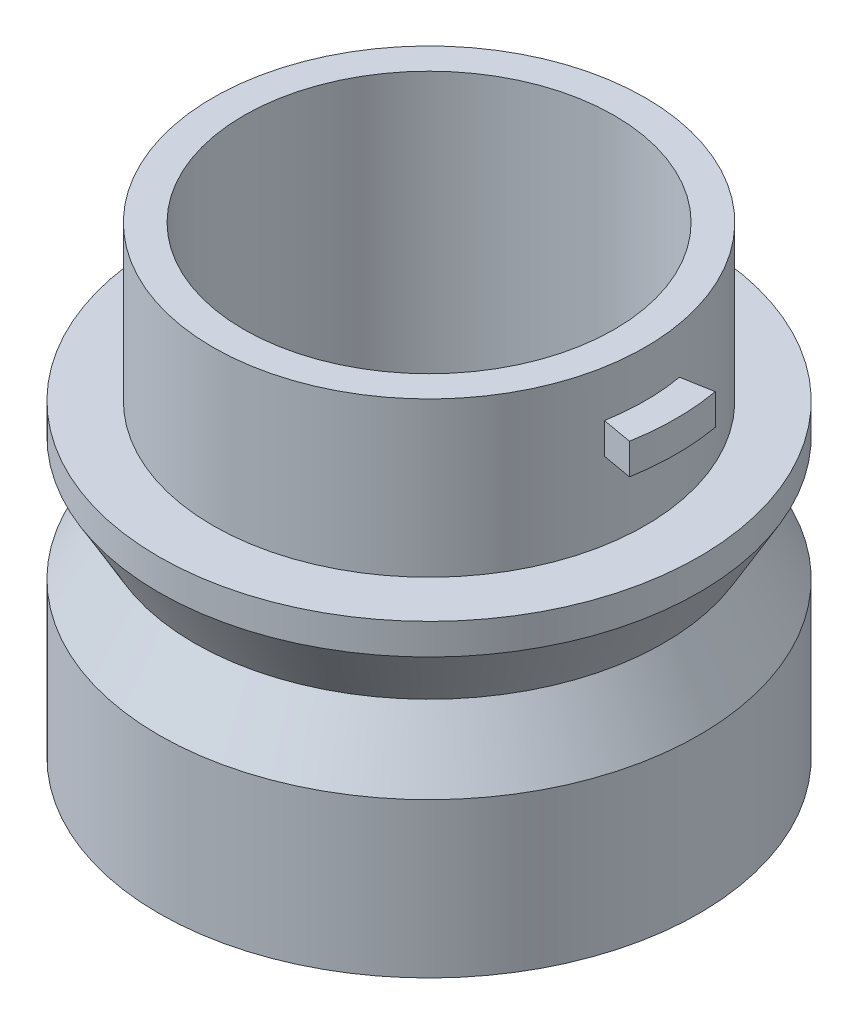
ISO-10303-21;
HEADER;
FILE_DESCRIPTION(('STEP AP214'),'2;1');
FILE_NAME('part.step','',(''),(''),'','','');
FILE_SCHEMA(('AUTOMOTIVE_DESIGN { 1 0 10303 214 1 1 1 1 }'));
ENDSEC;
DATA;
#1=APPLICATION_CONTEXT('core data for automotive mechanical design processes');
#2=APPLICATION_PROTOCOL_DEFINITION('international standard','automotive_design',2000,#1);
#3=PRODUCT_CONTEXT('',#1,'mechanical');
#4=PRODUCT('Part','Part','',(#3));
#5=PRODUCT_RELATED_PRODUCT_CATEGORY('part','',(#4));
#6=PRODUCT_DEFINITION_FORMATION('','',#4);
#7=PRODUCT_DEFINITION_CONTEXT('part definition',#1,'design');
#8=PRODUCT_DEFINITION('design','',#6,#7);
#9=PRODUCT_DEFINITION_SHAPE('','',#8);
#10=(LENGTH_UNIT() NAMED_UNIT(*) SI_UNIT(.MILLI.,.METRE.));
#11=(NAMED_UNIT(*) PLANE_ANGLE_UNIT() SI_UNIT($,.RADIAN.));
#12=(NAMED_UNIT(*) SI_UNIT($,.STERADIAN.) SOLID_ANGLE_UNIT());
#13=UNCERTAINTY_MEASURE_WITH_UNIT(LENGTH_MEASURE(1.E-05),#10,'distance_accuracy_value','');
#14=(GEOMETRIC_REPRESENTATION_CONTEXT(3) GLOBAL_UNCERTAINTY_ASSIGNED_CONTEXT((#13)) GLOBAL_UNIT_ASSIGNED_CONTEXT((#10,
#11,#12)) REPRESENTATION_CONTEXT('',''));
#15=CARTESIAN_POINT('',(0.,0.,0.));
#16=DIRECTION('',(0.,0.,1.));
#17=DIRECTION('',(1.,0.,0.));
#18=AXIS2_PLACEMENT_3D('',#15,#16,#17);
#19=CARTESIAN_POINT('',(0.,40.467735012162,0.));
#20=DIRECTION('',(0.,1.,0.));
#21=DIRECTION('',(0.,0.,1.));
#22=AXIS2_PLACEMENT_3D('',#19,#20,#21);
#23=CYLINDRICAL_SURFACE('',#22,14.5);
#24=DIRECTION('',(0.,-1.,0.));
#25=VECTOR('',#24,1.);
#26=CARTESIAN_POINT('',(14.156292103239,-15.,-3.1383744021025));
#27=LINE('',#26,#25);
#28=CARTESIAN_POINT('',(14.156292103239,-10.7,-3.1383744021025));
#29=VERTEX_POINT('',#28);
#30=CARTESIAN_POINT('',(14.156292103239,-15.,-3.1383744021025));
#31=VERTEX_POINT('',#30);
#32=EDGE_CURVE('E58',#29,#31,#27,.T.);
#33=ORIENTED_EDGE('',*,*,#32,.F.);
#34=CARTESIAN_POINT('',(0.,-10.7,0.));
#35=DIRECTION('',(0.,-1.,0.));
#36=DIRECTION('',(0.,0.,-1.));
#37=AXIS2_PLACEMENT_3D('',#34,#35,#36);
#38=CIRCLE('',#37,14.5);
#39=CARTESIAN_POINT('',(10.2530483272049,-10.7,-10.253048327205));
#40=VERTEX_POINT('',#39);
#41=EDGE_CURVE('E190',#29,#40,#38,.F.);
#42=ORIENTED_EDGE('',*,*,#41,.T.);
#43=DIRECTION('',(0.,1.,0.));
#44=VECTOR('',#43,1.);
#45=CARTESIAN_POINT('',(10.2530483272049,40.467735012162,-10.253048327205));
#46=LINE('',#45,#44);
#47=CARTESIAN_POINT('',(10.2530483272049,-8.2,-10.253048327205));
#48=VERTEX_POINT('',#47);
#49=EDGE_CURVE('E11',#48,#40,#46,.F.);
#50=ORIENTED_EDGE('',*,*,#49,.F.);
#51=CARTESIAN_POINT('',(0.,-8.2,0.));
#52=DIRECTION('',(0.,1.,0.));
#53=DIRECTION('',(0.,0.,1.));
#54=AXIS2_PLACEMENT_3D('',#51,#52,#53);
#55=CIRCLE('',#54,14.5);
#56=CARTESIAN_POINT('',(14.156292103239,-8.2,3.1383744021025));
#57=VERTEX_POINT('',#56);
#58=EDGE_CURVE('E230',#57,#48,#55,.T.);
#59=ORIENTED_EDGE('',*,*,#58,.F.);
#60=DIRECTION('',(0.,-1.,0.));
#61=VECTOR('',#60,1.);
#62=CARTESIAN_POINT('',(14.156292103239,-15.,3.1383744021025));
#63=LINE('',#62,#61);
#64=CARTESIAN_POINT('',(14.156292103239,-15.,3.1383744021025));
#65=VERTEX_POINT('',#64);
#66=EDGE_CURVE('E221',#57,#65,#63,.T.);
#67=ORIENTED_EDGE('',*,*,#66,.T.);
#68=CARTESIAN_POINT('',(0.,-15.,0.));
#69=DIRECTION('',(0.,1.,0.));
#70=DIRECTION('',(0.,0.,1.));
#71=AXIS2_PLACEMENT_3D('',#68,#69,#70);
#72=CIRCLE('',#71,14.5);
#73=CARTESIAN_POINT('',(-14.156292103239,-15.,3.1383744021025));
#74=VERTEX_POINT('',#73);
#75=EDGE_CURVE('E346',#74,#65,#72,.T.);
#76=ORIENTED_EDGE('',*,*,#75,.F.);
#77=DIRECTION('',(0.,1.,0.));
#78=VECTOR('',#77,1.);
#79=CARTESIAN_POINT('',(-14.156292103239,-8.2,3.1383744021025));
#80=LINE('',#79,#78);
#81=CARTESIAN_POINT('',(-14.156292103239,-10.7,3.1383744021025));
#82=VERTEX_POINT('',#81);
#83=EDGE_CURVE('E238',#74,#82,#80,.T.);
#84=ORIENTED_EDGE('',*,*,#83,.T.);
#85=CARTESIAN_POINT('',(0.,-10.7,0.));
#86=DIRECTION('',(0.,1.,0.));
#87=DIRECTION('',(0.,0.,1.));
#88=AXIS2_PLACEMENT_3D('',#85,#86,#87);
#89=CIRCLE('',#88,14.5);
#90=CARTESIAN_POINT('',(-10.2530483272049,-10.7,10.253048327205));
#91=VERTEX_POINT('',#90);
#92=EDGE_CURVE('E50',#91,#82,#89,.F.);
#93=ORIENTED_EDGE('',*,*,#92,.F.);
#94=DIRECTION('',(0.,1.,0.));
#95=VECTOR('',#94,1.);
#96=CARTESIAN_POINT('',(-10.2530483272049,40.467735012162,10.253048327205));
#97=LINE('',#96,#95);
#98=CARTESIAN_POINT('',(-10.2530483272049,-8.2,10.253048327205));
#99=VERTEX_POINT('',#98);
#100=EDGE_CURVE('E360',#91,#99,#97,.T.);
#101=ORIENTED_EDGE('',*,*,#100,.T.);
#102=CARTESIAN_POINT('',(0.,-8.2,0.));
#103=DIRECTION('',(0.,1.,0.));
#104=DIRECTION('',(0.,0.,1.));
#105=AXIS2_PLACEMENT_3D('',#102,#103,#104);
#106=CIRCLE('',#105,14.5);
#107=CARTESIAN_POINT('',(-14.156292103239,-8.2,-3.1383744021025));
#108=VERTEX_POINT('',#107);
#109=EDGE_CURVE('E254',#108,#99,#106,.T.);
#110=ORIENTED_EDGE('',*,*,#109,.F.);
#111=DIRECTION('',(0.,1.,0.));
#112=VECTOR('',#111,1.);
#113=CARTESIAN_POINT('',(-14.156292103239,-8.2,-3.1383744021025));
#114=LINE('',#113,#112);
#115=CARTESIAN_POINT('',(-14.156292103239,-15.,-3.1383744021025));
#116=VERTEX_POINT('',#115);
#117=EDGE_CURVE('E247',#116,#108,#114,.T.);
#118=ORIENTED_EDGE('',*,*,#117,.F.);
#119=EDGE_CURVE('E345',#31,#116,#72,.T.);
#120=ORIENTED_EDGE('',*,*,#119,.F.);
#121=EDGE_LOOP('',(#33,#42,#50,#59,#67,#76,#84,#93,#101,#110,#118,#120));
#122=FACE_BOUND('',#121,.T.);
#123=CARTESIAN_POINT('',(0.,-5.,0.));
#124=DIRECTION('',(0.,1.,0.));
#125=DIRECTION('',(0.,0.,1.));
#126=AXIS2_PLACEMENT_3D('',#123,#124,#125);
#127=CIRCLE('',#126,14.5);
#128=CARTESIAN_POINT('',(0.,-5.,14.5));
#129=VERTEX_POINT('',#128);
#130=EDGE_CURVE('E349',#129,#129,#127,.T.);
#131=ORIENTED_EDGE('',*,*,#130,.T.);
#132=EDGE_LOOP('',(#131));
#133=FACE_BOUND('',#132,.T.);
#134=ADVANCED_FACE('F35',(#122,#133),#23,.F.);
#135=CARTESIAN_POINT('',(-16.3041433189029,-15.,3.61454155276633));
#136=DIRECTION('',(0.216439613938103,0.,0.976296007119933));
#137=DIRECTION('',(0.976296007119933,0.,-0.216439613938103));
#138=AXIS2_PLACEMENT_3D('',#135,#136,#137);
#139=PLANE('',#138);
#140=DIRECTION('',(-0.976296007119933,0.,0.216439613938103));
#141=VECTOR('',#140,1.);
#142=CARTESIAN_POINT('',(-16.3041433189029,-10.7,3.61454155276633));
#143=LINE('',#142,#141);
#144=CARTESIAN_POINT('',(-16.3041433189029,-10.7,3.61454155276633));
#145=VERTEX_POINT('',#144);
#146=EDGE_CURVE('E358',#82,#145,#143,.T.);
#147=ORIENTED_EDGE('',*,*,#146,.F.);
#148=ORIENTED_EDGE('',*,*,#83,.F.);
#149=DIRECTION('',(0.976296007119933,0.,-0.216439613938103));
#150=VECTOR('',#149,1.);
#151=CARTESIAN_POINT('',(-16.3041433189029,-15.,3.61454155276633));
#152=LINE('',#151,#150);
#153=CARTESIAN_POINT('',(-16.3041433189029,-15.,3.61454155276633));
#154=VERTEX_POINT('',#153);
#155=EDGE_CURVE('E235',#154,#74,#152,.T.);
#156=ORIENTED_EDGE('',*,*,#155,.F.);
#157=DIRECTION('',(0.,-1.,0.));
#158=VECTOR('',#157,1.);
#159=CARTESIAN_POINT('',(-16.3041433189029,-8.2,3.61454155276633));
#160=LINE('',#159,#158);
#161=EDGE_CURVE('E233',#145,#154,#160,.T.);
#162=ORIENTED_EDGE('',*,*,#161,.F.);
#163=EDGE_LOOP('',(#147,#148,#156,#162));
#164=FACE_BOUND('',#163,.T.);
#165=ADVANCED_FACE('F406',(#164),#139,.F.);
#166=CARTESIAN_POINT('',(14.5,-15.,0.));
#167=DIRECTION('',(0.,1.,0.));
#168=DIRECTION('',(0.,0.,1.));
#169=AXIS2_PLACEMENT_3D('',#166,#167,#168);
#170=PLANE('',#169);
#171=CARTESIAN_POINT('',(0.,-15.,0.));
#172=DIRECTION('',(0.,1.,0.));
#173=DIRECTION('',(0.,0.,1.));
#174=AXIS2_PLACEMENT_3D('',#171,#172,#173);
#175=CIRCLE('',#174,17.5);
#176=CARTESIAN_POINT('',(0.,-15.,17.5));
#177=VERTEX_POINT('',#176);
#178=EDGE_CURVE('E342',#177,#177,#175,.T.);
#179=ORIENTED_EDGE('',*,*,#178,.F.);
#180=EDGE_LOOP('',(#179));
#181=FACE_BOUND('',#180,.T.);
#182=ORIENTED_EDGE('',*,*,#75,.T.);
#183=DIRECTION('',(0.976296007119933,0.,0.216439613938103));
#184=VECTOR('',#183,1.);
#185=CARTESIAN_POINT('',(16.3041433189029,-15.,3.61454155276633));
#186=LINE('',#185,#184);
#187=CARTESIAN_POINT('',(16.3041433189029,-15.,3.61454155276633));
#188=VERTEX_POINT('',#187);
#189=EDGE_CURVE('E224',#65,#188,#186,.T.);
#190=ORIENTED_EDGE('',*,*,#189,.T.);
#191=CARTESIAN_POINT('',(0.,-15.,0.));
#192=DIRECTION('',(0.,1.,0.));
#193=DIRECTION('',(0.,0.,1.));
#194=AXIS2_PLACEMENT_3D('',#191,#192,#193);
#195=CIRCLE('',#194,16.7);
#196=CARTESIAN_POINT('',(16.3041433189029,-15.,-3.61454155276633));
#197=VERTEX_POINT('',#196);
#198=EDGE_CURVE('E227',#188,#197,#195,.T.);
#199=ORIENTED_EDGE('',*,*,#198,.T.);
#200=DIRECTION('',(0.976296007119933,0.,-0.216439613938103));
#201=VECTOR('',#200,1.);
#202=CARTESIAN_POINT('',(16.3041433189029,-15.,-3.61454155276633));
#203=LINE('',#202,#201);
#204=EDGE_CURVE('E215',#31,#197,#203,.T.);
#205=ORIENTED_EDGE('',*,*,#204,.F.);
#206=ORIENTED_EDGE('',*,*,#119,.T.);
#207=DIRECTION('',(0.976296007119933,0.,0.216439613938103));
#208=VECTOR('',#207,1.);
#209=CARTESIAN_POINT('',(-16.3041433189029,-15.,-3.61454155276633));
#210=LINE('',#209,#208);
#211=CARTESIAN_POINT('',(-16.3041433189029,-15.,-3.61454155276633));
#212=VERTEX_POINT('',#211);
#213=EDGE_CURVE('E244',#212,#116,#210,.T.);
#214=ORIENTED_EDGE('',*,*,#213,.F.);
#215=CARTESIAN_POINT('',(0.,-15.,0.));
#216=DIRECTION('',(0.,1.,0.));
#217=DIRECTION('',(0.,0.,1.));
#218=AXIS2_PLACEMENT_3D('',#215,#216,#217);
#219=CIRCLE('',#218,16.7);
#220=EDGE_CURVE('E256',#212,#154,#219,.T.);
#221=ORIENTED_EDGE('',*,*,#220,.T.);
#222=ORIENTED_EDGE('',*,*,#155,.T.);
#223=EDGE_LOOP('',(#182,#190,#199,#205,#206,#214,#221,#222));
#224=FACE_BOUND('',#223,.T.);
#225=ADVANCED_FACE('F384',(#181,#224),#170,.F.);
#226=CARTESIAN_POINT('',(0.,40.467735012162,0.));
#227=DIRECTION('',(0.,1.,0.));
#228=DIRECTION('',(0.,0.,1.));
#229=AXIS2_PLACEMENT_3D('',#226,#227,#228);
#230=CYLINDRICAL_SURFACE('',#229,14.);
#231=CARTESIAN_POINT('',(0.,9.99999999999999,0.));
#232=DIRECTION('',(0.,1.,0.));
#233=DIRECTION('',(0.,0.,1.));
#234=AXIS2_PLACEMENT_3D('',#231,#232,#233);
#235=CIRCLE('',#234,14.);
#236=CARTESIAN_POINT('',(-13.7873085421709,10.,-2.43107448733703));
#237=VERTEX_POINT('',#236);
#238=CARTESIAN_POINT('',(-13.7873085421709,10.,2.43107448733703));
#239=VERTEX_POINT('',#238);
#240=EDGE_CURVE('E286',#237,#239,#235,.T.);
#241=ORIENTED_EDGE('',*,*,#240,.F.);
#242=DIRECTION('',(0.,1.,0.));
#243=VECTOR('',#242,1.);
#244=CARTESIAN_POINT('',(-13.7873085421709,12.,-2.43107448733703));
#245=LINE('',#244,#243);
#246=CARTESIAN_POINT('',(-13.7873085421709,12.,-2.43107448733703));
#247=VERTEX_POINT('',#246);
#248=EDGE_CURVE('E280',#237,#247,#245,.T.);
#249=ORIENTED_EDGE('',*,*,#248,.T.);
#250=CARTESIAN_POINT('',(0.,12.,0.));
#251=DIRECTION('',(0.,1.,0.));
#252=DIRECTION('',(0.,0.,1.));
#253=AXIS2_PLACEMENT_3D('',#250,#251,#252);
#254=CIRCLE('',#253,14.);
#255=CARTESIAN_POINT('',(-13.7873085421709,12.,2.43107448733703));
#256=VERTEX_POINT('',#255);
#257=EDGE_CURVE('E289',#247,#256,#254,.T.);
#258=ORIENTED_EDGE('',*,*,#257,.T.);
#259=DIRECTION('',(0.,1.,0.));
#260=VECTOR('',#259,1.);
#261=CARTESIAN_POINT('',(-13.7873085421709,12.,2.43107448733703));
#262=LINE('',#261,#260);
#263=EDGE_CURVE('E268',#239,#256,#262,.T.);
#264=ORIENTED_EDGE('',*,*,#263,.F.);
#265=EDGE_LOOP('',(#241,#249,#258,#264));
#266=FACE_BOUND('',#265,.T.);
#267=CARTESIAN_POINT('',(0.,5.,0.));
#268=DIRECTION('',(0.,1.,0.));
#269=DIRECTION('',(0.,0.,1.));
#270=AXIS2_PLACEMENT_3D('',#267,#268,#269);
#271=CIRCLE('',#270,14.);
#272=CARTESIAN_POINT('',(0.,5.,14.));
#273=VERTEX_POINT('',#272);
#274=EDGE_CURVE('E327',#273,#273,#271,.T.);
#275=ORIENTED_EDGE('',*,*,#274,.T.);
#276=EDGE_LOOP('',(#275));
#277=FACE_BOUND('',#276,.T.);
#278=CARTESIAN_POINT('',(0.,15.,0.));
#279=DIRECTION('',(0.,1.,0.));
#280=DIRECTION('',(0.,0.,1.));
#281=AXIS2_PLACEMENT_3D('',#278,#279,#280);
#282=CIRCLE('',#281,14.);
#283=CARTESIAN_POINT('',(0.,15.,14.));
#284=VERTEX_POINT('',#283);
#285=EDGE_CURVE('E324',#284,#284,#282,.T.);
#286=ORIENTED_EDGE('',*,*,#285,.F.);
#287=EDGE_LOOP('',(#286));
#288=FACE_BOUND('',#287,.T.);
#289=DIRECTION('',(0.,-1.,0.));
#290=VECTOR('',#289,1.);
#291=CARTESIAN_POINT('',(13.7873085421709,10.,2.43107448733703));
#292=LINE('',#291,#290);
#293=CARTESIAN_POINT('',(13.7873085421709,12.,2.43107448733703));
#294=VERTEX_POINT('',#293);
#295=CARTESIAN_POINT('',(13.7873085421709,10.,2.43107448733703));
#296=VERTEX_POINT('',#295);
#297=EDGE_CURVE('E302',#294,#296,#292,.T.);
#298=ORIENTED_EDGE('',*,*,#297,.F.);
#299=CARTESIAN_POINT('',(0.,12.,0.));
#300=DIRECTION('',(0.,1.,0.));
#301=DIRECTION('',(0.,0.,1.));
#302=AXIS2_PLACEMENT_3D('',#299,#300,#301);
#303=CIRCLE('',#302,14.);
#304=CARTESIAN_POINT('',(13.7873085421709,12.,-2.43107448733703));
#305=VERTEX_POINT('',#304);
#306=EDGE_CURVE('E321',#294,#305,#303,.T.);
#307=ORIENTED_EDGE('',*,*,#306,.T.);
#308=DIRECTION('',(0.,-1.,0.));
#309=VECTOR('',#308,1.);
#310=CARTESIAN_POINT('',(13.7873085421709,10.,-2.43107448733703));
#311=LINE('',#310,#309);
#312=CARTESIAN_POINT('',(13.7873085421709,10.,-2.43107448733703));
#313=VERTEX_POINT('',#312);
#314=EDGE_CURVE('E291',#305,#313,#311,.T.);
#315=ORIENTED_EDGE('',*,*,#314,.T.);
#316=CARTESIAN_POINT('',(0.,9.99999999999999,0.));
#317=DIRECTION('',(0.,1.,0.));
#318=DIRECTION('',(0.,0.,1.));
#319=AXIS2_PLACEMENT_3D('',#316,#317,#318);
#320=CIRCLE('',#319,14.);
#321=EDGE_CURVE('E314',#296,#313,#320,.T.);
#322=ORIENTED_EDGE('',*,*,#321,.F.);
#323=EDGE_LOOP('',(#298,#307,#315,#322));
#324=FACE_BOUND('',#323,.T.);
#325=ADVANCED_FACE('F425',(#266,#277,#288,#324),#230,.T.);
#326=CARTESIAN_POINT('',(14.,15.,0.));
#327=DIRECTION('',(0.,-1.,0.));
#328=DIRECTION('',(0.,0.,-1.));
#329=AXIS2_PLACEMENT_3D('',#326,#327,#328);
#330=PLANE('',#329);
#331=CARTESIAN_POINT('',(0.,15.,0.));
#332=DIRECTION('',(0.,1.,0.));
#333=DIRECTION('',(0.,0.,1.));
#334=AXIS2_PLACEMENT_3D('',#331,#332,#333);
#335=CIRCLE('',#334,12.);
#336=CARTESIAN_POINT('',(0.,15.,12.));
#337=VERTEX_POINT('',#336);
#338=EDGE_CURVE('E355',#337,#337,#335,.T.);
#339=ORIENTED_EDGE('',*,*,#338,.F.);
#340=EDGE_LOOP('',(#339));
#341=FACE_BOUND('',#340,.T.);
#342=ORIENTED_EDGE('',*,*,#285,.T.);
#343=EDGE_LOOP('',(#342));
#344=FACE_BOUND('',#343,.T.);
#345=ADVANCED_FACE('F37',(#341,#344),#330,.F.);
#346=CARTESIAN_POINT('',(0.,40.467735012162,0.));
#347=DIRECTION('',(0.,1.,0.));
#348=DIRECTION('',(0.,0.,1.));
#349=AXIS2_PLACEMENT_3D('',#346,#347,#348);
#350=CYLINDRICAL_SURFACE('',#349,12.);
#351=CARTESIAN_POINT('',(0.,-5.,0.));
#352=DIRECTION('',(0.,1.,0.));
#353=DIRECTION('',(0.,0.,1.));
#354=AXIS2_PLACEMENT_3D('',#351,#352,#353);
#355=CIRCLE('',#354,12.);
#356=CARTESIAN_POINT('',(0.,-5.,12.));
#357=VERTEX_POINT('',#356);
#358=EDGE_CURVE('E352',#357,#357,#355,.T.);
#359=ORIENTED_EDGE('',*,*,#358,.F.);
#360=EDGE_LOOP('',(#359));
#361=FACE_BOUND('',#360,.T.);
#362=ORIENTED_EDGE('',*,*,#338,.T.);
#363=EDGE_LOOP('',(#362));
#364=FACE_BOUND('',#363,.T.);
#365=ADVANCED_FACE('F418',(#361,#364),#350,.F.);
#366=CARTESIAN_POINT('',(12.,-5.,0.));
#367=DIRECTION('',(0.,1.,0.));
#368=DIRECTION('',(0.,0.,1.));
#369=AXIS2_PLACEMENT_3D('',#366,#367,#368);
#370=PLANE('',#369);
#371=ORIENTED_EDGE('',*,*,#130,.F.);
#372=EDGE_LOOP('',(#371));
#373=FACE_BOUND('',#372,.T.);
#374=ORIENTED_EDGE('',*,*,#358,.T.);
#375=EDGE_LOOP('',(#374));
#376=FACE_BOUND('',#375,.T.);
#377=ADVANCED_FACE('F415',(#373,#376),#370,.F.);
#378=CARTESIAN_POINT('',(0.,40.467735012162,0.));
#379=DIRECTION('',(0.,1.,0.));
#380=DIRECTION('',(0.,0.,1.));
#381=AXIS2_PLACEMENT_3D('',#378,#379,#380);
#382=CYLINDRICAL_SURFACE('',#381,17.5);
#383=CARTESIAN_POINT('',(0.,-5.,0.));
#384=DIRECTION('',(0.,1.,0.));
#385=DIRECTION('',(0.,0.,1.));
#386=AXIS2_PLACEMENT_3D('',#383,#384,#385);
#387=CIRCLE('',#386,17.5);
#388=CARTESIAN_POINT('',(0.,-5.,17.5));
#389=VERTEX_POINT('',#388);
#390=EDGE_CURVE('E339',#389,#389,#387,.T.);
#391=ORIENTED_EDGE('',*,*,#390,.F.);
#392=EDGE_LOOP('',(#391));
#393=FACE_BOUND('',#392,.T.);
#394=ORIENTED_EDGE('',*,*,#178,.T.);
#395=EDGE_LOOP('',(#394));
#396=FACE_BOUND('',#395,.T.);
#397=ADVANCED_FACE('F417',(#393,#396),#382,.T.);
#398=CARTESIAN_POINT('',(0.,-5.,0.));
#399=DIRECTION('',(0.,-1.,0.));
#400=DIRECTION('',(0.,0.,-1.));
#401=AXIS2_PLACEMENT_3D('',#398,#399,#400);
#402=CONICAL_SURFACE('',#401,17.5,0.5235987755983);
#403=CARTESIAN_POINT('',(0.,-1.,0.));
#404=DIRECTION('',(0.,1.,0.));
#405=DIRECTION('',(0.,0.,1.));
#406=AXIS2_PLACEMENT_3D('',#403,#404,#405);
#407=CIRCLE('',#406,15.1905989232415);
#408=CARTESIAN_POINT('',(0.,-1.,15.1905989232415));
#409=VERTEX_POINT('',#408);
#410=EDGE_CURVE('E336',#409,#409,#407,.T.);
#411=ORIENTED_EDGE('',*,*,#410,.F.);
#412=EDGE_LOOP('',(#411));
#413=FACE_BOUND('',#412,.T.);
#414=ORIENTED_EDGE('',*,*,#390,.T.);
#415=EDGE_LOOP('',(#414));
#416=FACE_BOUND('',#415,.T.);
#417=ADVANCED_FACE('F475',(#413,#416),#402,.T.);
#418=CARTESIAN_POINT('',(0.,-1.,0.));
#419=DIRECTION('',(0.,1.,0.));
#420=DIRECTION('',(0.,0.,1.));
#421=AXIS2_PLACEMENT_3D('',#418,#419,#420);
#422=CONICAL_SURFACE('',#421,15.1905989232415,0.523598775598299);
#423=CARTESIAN_POINT('',(0.,3.,0.));
#424=DIRECTION('',(0.,1.,0.));
#425=DIRECTION('',(0.,0.,1.));
#426=AXIS2_PLACEMENT_3D('',#423,#424,#425);
#427=CIRCLE('',#426,17.5);
#428=CARTESIAN_POINT('',(0.,3.,17.5));
#429=VERTEX_POINT('',#428);
#430=EDGE_CURVE('E333',#429,#429,#427,.T.);
#431=ORIENTED_EDGE('',*,*,#430,.F.);
#432=EDGE_LOOP('',(#431));
#433=FACE_BOUND('',#432,.T.);
#434=ORIENTED_EDGE('',*,*,#410,.T.);
#435=EDGE_LOOP('',(#434));
#436=FACE_BOUND('',#435,.T.);
#437=ADVANCED_FACE('F471',(#433,#436),#422,.T.);
#438=CARTESIAN_POINT('',(0.,40.467735012162,0.));
#439=DIRECTION('',(0.,1.,0.));
#440=DIRECTION('',(0.,0.,1.));
#441=AXIS2_PLACEMENT_3D('',#438,#439,#440);
#442=CYLINDRICAL_SURFACE('',#441,17.5);
#443=CARTESIAN_POINT('',(0.,5.,0.));
#444=DIRECTION('',(0.,1.,0.));
#445=DIRECTION('',(0.,0.,1.));
#446=AXIS2_PLACEMENT_3D('',#443,#444,#445);
#447=CIRCLE('',#446,17.5);
#448=CARTESIAN_POINT('',(0.,5.,17.5));
#449=VERTEX_POINT('',#448);
#450=EDGE_CURVE('E330',#449,#449,#447,.T.);
#451=ORIENTED_EDGE('',*,*,#450,.F.);
#452=EDGE_LOOP('',(#451));
#453=FACE_BOUND('',#452,.T.);
#454=ORIENTED_EDGE('',*,*,#430,.T.);
#455=EDGE_LOOP('',(#454));
#456=FACE_BOUND('',#455,.T.);
#457=ADVANCED_FACE('F467',(#453,#456),#442,.T.);
#458=CARTESIAN_POINT('',(14.,5.,0.));
#459=DIRECTION('',(0.,-1.,0.));
#460=DIRECTION('',(0.,0.,-1.));
#461=AXIS2_PLACEMENT_3D('',#458,#459,#460);
#462=PLANE('',#461);
#463=ORIENTED_EDGE('',*,*,#274,.F.);
#464=EDGE_LOOP('',(#463));
#465=FACE_BOUND('',#464,.T.);
#466=ORIENTED_EDGE('',*,*,#450,.T.);
#467=EDGE_LOOP('',(#466));
#468=FACE_BOUND('',#467,.T.);
#469=ADVANCED_FACE('F461',(#465,#468),#462,.F.);
#470=CARTESIAN_POINT('',(13.7873085421709,12.,2.43107448733703));
#471=DIRECTION('',(0.,-1.,0.));
#472=DIRECTION('',(0.,0.,-1.));
#473=AXIS2_PLACEMENT_3D('',#470,#471,#472);
#474=PLANE('',#473);
#475=CARTESIAN_POINT('',(0.,12.,0.));
#476=DIRECTION('',(0.,1.,0.));
#477=DIRECTION('',(0.,0.,1.));
#478=AXIS2_PLACEMENT_3D('',#475,#476,#477);
#479=CIRCLE('',#478,16.);
#480=CARTESIAN_POINT('',(15.7569240481953,12.,2.77837084267089));
#481=VERTEX_POINT('',#480);
#482=CARTESIAN_POINT('',(15.7569240481953,12.,-2.77837084267089));
#483=VERTEX_POINT('',#482);
#484=EDGE_CURVE('E319',#481,#483,#479,.T.);
#485=ORIENTED_EDGE('',*,*,#484,.T.);
#486=DIRECTION('',(-0.984807753012208,0.,0.173648177666931));
#487=VECTOR('',#486,1.);
#488=CARTESIAN_POINT('',(13.7873085421709,12.,-2.43107448733703));
#489=LINE('',#488,#487);
#490=EDGE_CURVE('E300',#483,#305,#489,.T.);
#491=ORIENTED_EDGE('',*,*,#490,.T.);
#492=ORIENTED_EDGE('',*,*,#306,.F.);
#493=DIRECTION('',(-0.984807753012208,0.,-0.173648177666931));
#494=VECTOR('',#493,1.);
#495=CARTESIAN_POINT('',(13.7873085421709,12.,2.43107448733703));
#496=LINE('',#495,#494);
#497=EDGE_CURVE('E311',#481,#294,#496,.T.);
#498=ORIENTED_EDGE('',*,*,#497,.F.);
#499=EDGE_LOOP('',(#485,#491,#492,#498));
#500=FACE_BOUND('',#499,.T.);
#501=ADVANCED_FACE('F444',(#500),#474,.F.);
#502=CARTESIAN_POINT('',(0.,45.3066617431812,0.));
#503=DIRECTION('',(0.,1.,0.));
#504=DIRECTION('',(0.,0.,1.));
#505=AXIS2_PLACEMENT_3D('',#502,#503,#504);
#506=CYLINDRICAL_SURFACE('',#505,16.);
#507=CARTESIAN_POINT('',(0.,10.,0.));
#508=DIRECTION('',(0.,1.,0.));
#509=DIRECTION('',(0.,0.,1.));
#510=AXIS2_PLACEMENT_3D('',#507,#508,#509);
#511=CIRCLE('',#510,16.);
#512=CARTESIAN_POINT('',(15.7569240481953,10.,2.77837084267089));
#513=VERTEX_POINT('',#512);
#514=CARTESIAN_POINT('',(15.7569240481953,10.,-2.77837084267089));
#515=VERTEX_POINT('',#514);
#516=EDGE_CURVE('E317',#513,#515,#511,.T.);
#517=ORIENTED_EDGE('',*,*,#516,.T.);
#518=DIRECTION('',(0.,1.,0.));
#519=VECTOR('',#518,1.);
#520=CARTESIAN_POINT('',(15.7569240481953,12.,-2.77837084267089));
#521=LINE('',#520,#519);
#522=EDGE_CURVE('E297',#515,#483,#521,.T.);
#523=ORIENTED_EDGE('',*,*,#522,.T.);
#524=ORIENTED_EDGE('',*,*,#484,.F.);
#525=DIRECTION('',(0.,1.,0.));
#526=VECTOR('',#525,1.);
#527=CARTESIAN_POINT('',(15.7569240481953,12.,2.77837084267089));
#528=LINE('',#527,#526);
#529=EDGE_CURVE('E308',#513,#481,#528,.T.);
#530=ORIENTED_EDGE('',*,*,#529,.F.);
#531=EDGE_LOOP('',(#517,#523,#524,#530));
#532=FACE_BOUND('',#531,.T.);
#533=ADVANCED_FACE('F453',(#532),#506,.T.);
#534=CARTESIAN_POINT('',(15.7569240481953,10.,2.77837084267089));
#535=DIRECTION('',(0.,1.,0.));
#536=DIRECTION('',(0.,0.,1.));
#537=AXIS2_PLACEMENT_3D('',#534,#535,#536);
#538=PLANE('',#537);
#539=DIRECTION('',(0.984807753012208,0.,0.173648177666931));
#540=VECTOR('',#539,1.);
#541=CARTESIAN_POINT('',(15.7569240481953,10.,2.77837084267089));
#542=LINE('',#541,#540);
#543=EDGE_CURVE('E305',#296,#513,#542,.T.);
#544=ORIENTED_EDGE('',*,*,#543,.F.);
#545=ORIENTED_EDGE('',*,*,#321,.T.);
#546=DIRECTION('',(0.984807753012208,0.,-0.173648177666931));
#547=VECTOR('',#546,1.);
#548=CARTESIAN_POINT('',(15.7569240481953,10.,-2.77837084267089));
#549=LINE('',#548,#547);
#550=EDGE_CURVE('E294',#313,#515,#549,.T.);
#551=ORIENTED_EDGE('',*,*,#550,.T.);
#552=ORIENTED_EDGE('',*,*,#516,.F.);
#553=EDGE_LOOP('',(#544,#545,#551,#552));
#554=FACE_BOUND('',#553,.T.);
#555=ADVANCED_FACE('F451',(#554),#538,.F.);
#556=CARTESIAN_POINT('',(13.7873085421709,12.,2.43107448733703));
#557=DIRECTION('',(0.173648177666931,0.,-0.984807753012208));
#558=DIRECTION('',(-0.984807753012208,0.,-0.173648177666931));
#559=AXIS2_PLACEMENT_3D('',#556,#557,#558);
#560=PLANE('',#559);
#561=ORIENTED_EDGE('',*,*,#297,.T.);
#562=ORIENTED_EDGE('',*,*,#543,.T.);
#563=ORIENTED_EDGE('',*,*,#529,.T.);
#564=ORIENTED_EDGE('',*,*,#497,.T.);
#565=EDGE_LOOP('',(#561,#562,#563,#564));
#566=FACE_BOUND('',#565,.T.);
#567=ADVANCED_FACE('F440',(#566),#560,.F.);
#568=CARTESIAN_POINT('',(13.7873085421709,12.,-2.43107448733703));
#569=DIRECTION('',(-0.173648177666931,0.,-0.984807753012208));
#570=DIRECTION('',(-0.984807753012208,0.,0.173648177666931));
#571=AXIS2_PLACEMENT_3D('',#568,#569,#570);
#572=PLANE('',#571);
#573=ORIENTED_EDGE('',*,*,#314,.F.);
#574=ORIENTED_EDGE('',*,*,#490,.F.);
#575=ORIENTED_EDGE('',*,*,#522,.F.);
#576=ORIENTED_EDGE('',*,*,#550,.F.);
#577=EDGE_LOOP('',(#573,#574,#575,#576));
#578=FACE_BOUND('',#577,.T.);
#579=ADVANCED_FACE('F449',(#578),#572,.T.);
#580=CARTESIAN_POINT('',(-15.7569240481953,12.,-2.77837084267089));
#581=DIRECTION('',(0.,1.,0.));
#582=DIRECTION('',(0.,0.,1.));
#583=AXIS2_PLACEMENT_3D('',#580,#581,#582);
#584=PLANE('',#583);
#585=ORIENTED_EDGE('',*,*,#257,.F.);
#586=DIRECTION('',(-0.984807753012208,0.,-0.173648177666931));
#587=VECTOR('',#586,1.);
#588=CARTESIAN_POINT('',(-15.7569240481953,12.,-2.77837084267089));
#589=LINE('',#588,#587);
#590=CARTESIAN_POINT('',(-15.7569240481953,12.,-2.77837084267089));
#591=VERTEX_POINT('',#590);
#592=EDGE_CURVE('E271',#247,#591,#589,.T.);
#593=ORIENTED_EDGE('',*,*,#592,.T.);
#594=CARTESIAN_POINT('',(0.,12.,0.));
#595=DIRECTION('',(0.,1.,0.));
#596=DIRECTION('',(0.,0.,1.));
#597=AXIS2_PLACEMENT_3D('',#594,#595,#596);
#598=CIRCLE('',#597,16.);
#599=CARTESIAN_POINT('',(-15.7569240481953,12.,2.77837084267089));
#600=VERTEX_POINT('',#599);
#601=EDGE_CURVE('E282',#591,#600,#598,.T.);
#602=ORIENTED_EDGE('',*,*,#601,.T.);
#603=DIRECTION('',(-0.984807753012208,0.,0.173648177666931));
#604=VECTOR('',#603,1.);
#605=CARTESIAN_POINT('',(-15.7569240481953,12.,2.77837084267089));
#606=LINE('',#605,#604);
#607=EDGE_CURVE('E259',#256,#600,#606,.T.);
#608=ORIENTED_EDGE('',*,*,#607,.F.);
#609=EDGE_LOOP('',(#585,#593,#602,#608));
#610=FACE_BOUND('',#609,.T.);
#611=ADVANCED_FACE('F572',(#610),#584,.T.);
#612=CARTESIAN_POINT('',(-13.7873085421709,10.,-2.43107448733703));
#613=DIRECTION('',(0.,-1.,0.));
#614=DIRECTION('',(0.,0.,-1.));
#615=AXIS2_PLACEMENT_3D('',#612,#613,#614);
#616=PLANE('',#615);
#617=CARTESIAN_POINT('',(0.,10.,0.));
#618=DIRECTION('',(0.,1.,0.));
#619=DIRECTION('',(0.,0.,1.));
#620=AXIS2_PLACEMENT_3D('',#617,#618,#619);
#621=CIRCLE('',#620,16.);
#622=CARTESIAN_POINT('',(-15.7569240481953,10.,-2.77837084267089));
#623=VERTEX_POINT('',#622);
#624=CARTESIAN_POINT('',(-15.7569240481953,10.,2.77837084267089));
#625=VERTEX_POINT('',#624);
#626=EDGE_CURVE('E284',#623,#625,#621,.T.);
#627=ORIENTED_EDGE('',*,*,#626,.F.);
#628=DIRECTION('',(0.984807753012208,0.,0.173648177666931));
#629=VECTOR('',#628,1.);
#630=CARTESIAN_POINT('',(-13.7873085421709,10.,-2.43107448733703));
#631=LINE('',#630,#629);
#632=EDGE_CURVE('E277',#623,#237,#631,.T.);
#633=ORIENTED_EDGE('',*,*,#632,.T.);
#634=ORIENTED_EDGE('',*,*,#240,.T.);
#635=DIRECTION('',(0.984807753012208,0.,-0.173648177666931));
#636=VECTOR('',#635,1.);
#637=CARTESIAN_POINT('',(-13.7873085421709,10.,2.43107448733703));
#638=LINE('',#637,#636);
#639=EDGE_CURVE('E265',#625,#239,#638,.T.);
#640=ORIENTED_EDGE('',*,*,#639,.F.);
#641=EDGE_LOOP('',(#627,#633,#634,#640));
#642=FACE_BOUND('',#641,.T.);
#643=ADVANCED_FACE('F581',(#642),#616,.T.);
#644=CARTESIAN_POINT('',(0.,45.3066617431812,0.));
#645=DIRECTION('',(0.,1.,0.));
#646=DIRECTION('',(0.,0.,1.));
#647=AXIS2_PLACEMENT_3D('',#644,#645,#646);
#648=CYLINDRICAL_SURFACE('',#647,16.);
#649=DIRECTION('',(0.,-1.,0.));
#650=VECTOR('',#649,1.);
#651=CARTESIAN_POINT('',(-15.7569240481953,10.,-2.77837084267089));
#652=LINE('',#651,#650);
#653=EDGE_CURVE('E274',#591,#623,#652,.T.);
#654=ORIENTED_EDGE('',*,*,#653,.T.);
#655=ORIENTED_EDGE('',*,*,#626,.T.);
#656=DIRECTION('',(0.,-1.,0.));
#657=VECTOR('',#656,1.);
#658=CARTESIAN_POINT('',(-15.7569240481953,10.,2.77837084267089));
#659=LINE('',#658,#657);
#660=EDGE_CURVE('E262',#600,#625,#659,.T.);
#661=ORIENTED_EDGE('',*,*,#660,.F.);
#662=ORIENTED_EDGE('',*,*,#601,.F.);
#663=EDGE_LOOP('',(#654,#655,#661,#662));
#664=FACE_BOUND('',#663,.T.);
#665=ADVANCED_FACE('F591',(#664),#648,.T.);
#666=CARTESIAN_POINT('',(-13.7873085421709,12.,-2.43107448733703));
#667=DIRECTION('',(0.173648177666931,0.,-0.984807753012208));
#668=DIRECTION('',(-0.984807753012208,0.,-0.173648177666931));
#669=AXIS2_PLACEMENT_3D('',#666,#667,#668);
#670=PLANE('',#669);
#671=ORIENTED_EDGE('',*,*,#592,.F.);
#672=ORIENTED_EDGE('',*,*,#248,.F.);
#673=ORIENTED_EDGE('',*,*,#632,.F.);
#674=ORIENTED_EDGE('',*,*,#653,.F.);
#675=EDGE_LOOP('',(#671,#672,#673,#674));
#676=FACE_BOUND('',#675,.T.);
#677=ADVANCED_FACE('F601',(#676),#670,.T.);
#678=CARTESIAN_POINT('',(-13.7873085421709,12.,2.43107448733703));
#679=DIRECTION('',(-0.173648177666931,0.,-0.984807753012208));
#680=DIRECTION('',(-0.984807753012208,0.,0.173648177666931));
#681=AXIS2_PLACEMENT_3D('',#678,#679,#680);
#682=PLANE('',#681);
#683=ORIENTED_EDGE('',*,*,#607,.T.);
#684=ORIENTED_EDGE('',*,*,#660,.T.);
#685=ORIENTED_EDGE('',*,*,#639,.T.);
#686=ORIENTED_EDGE('',*,*,#263,.T.);
#687=EDGE_LOOP('',(#683,#684,#685,#686));
#688=FACE_BOUND('',#687,.T.);
#689=ADVANCED_FACE('F610',(#688),#682,.F.);
#690=CARTESIAN_POINT('',(0.,-11.0207297683473,0.));
#691=DIRECTION('',(0.,1.,0.));
#692=DIRECTION('',(0.,0.,1.));
#693=AXIS2_PLACEMENT_3D('',#690,#691,#692);
#694=CYLINDRICAL_SURFACE('',#693,16.7);
#695=CARTESIAN_POINT('',(0.,-8.2,0.));
#696=DIRECTION('',(0.,1.,0.));
#697=DIRECTION('',(0.,0.,1.));
#698=AXIS2_PLACEMENT_3D('',#695,#696,#697);
#699=CIRCLE('',#698,16.7);
#700=CARTESIAN_POINT('',(-16.3041433189029,-8.2,-3.61454155276633));
#701=VERTEX_POINT('',#700);
#702=CARTESIAN_POINT('',(-11.8086832458153,-8.2,11.8086832458154));
#703=VERTEX_POINT('',#702);
#704=EDGE_CURVE('E252',#701,#703,#699,.T.);
#705=ORIENTED_EDGE('',*,*,#704,.T.);
#706=DIRECTION('',(0.,-1.,0.));
#707=VECTOR('',#706,1.);
#708=CARTESIAN_POINT('',(-11.8086832458153,-8.2,11.8086832458154));
#709=LINE('',#708,#707);
#710=CARTESIAN_POINT('',(-11.8086832458153,-10.7,11.8086832458154));
#711=VERTEX_POINT('',#710);
#712=EDGE_CURVE('E203',#703,#711,#709,.T.);
#713=ORIENTED_EDGE('',*,*,#712,.T.);
#714=CARTESIAN_POINT('',(0.,-10.7,0.));
#715=DIRECTION('',(0.,-1.,0.));
#716=DIRECTION('',(0.,0.,-1.));
#717=AXIS2_PLACEMENT_3D('',#714,#715,#716);
#718=CIRCLE('',#717,16.7);
#719=EDGE_CURVE('E208',#711,#145,#718,.T.);
#720=ORIENTED_EDGE('',*,*,#719,.T.);
#721=ORIENTED_EDGE('',*,*,#161,.T.);
#722=ORIENTED_EDGE('',*,*,#220,.F.);
#723=DIRECTION('',(0.,-1.,0.));
#724=VECTOR('',#723,1.);
#725=CARTESIAN_POINT('',(-16.3041433189029,-8.2,-3.61454155276633));
#726=LINE('',#725,#724);
#727=EDGE_CURVE('E241',#701,#212,#726,.T.);
#728=ORIENTED_EDGE('',*,*,#727,.F.);
#729=EDGE_LOOP('',(#705,#713,#720,#721,#722,#728));
#730=FACE_BOUND('',#729,.T.);
#731=ADVANCED_FACE('F374',(#730),#694,.F.);
#732=CARTESIAN_POINT('',(-16.3041433189029,-8.2,-3.61454155276633));
#733=DIRECTION('',(0.,1.,0.));
#734=DIRECTION('',(0.,0.,1.));
#735=AXIS2_PLACEMENT_3D('',#732,#733,#734);
#736=PLANE('',#735);
#737=DIRECTION('',(-0.707106781186546,0.,0.707106781186549));
#738=VECTOR('',#737,1.);
#739=CARTESIAN_POINT('',(-8.48528137423856,-8.2,8.48528137423859));
#740=LINE('',#739,#738);
#741=EDGE_CURVE('E200',#99,#703,#740,.T.);
#742=ORIENTED_EDGE('',*,*,#741,.T.);
#743=ORIENTED_EDGE('',*,*,#704,.F.);
#744=DIRECTION('',(-0.976296007119933,0.,-0.216439613938103));
#745=VECTOR('',#744,1.);
#746=CARTESIAN_POINT('',(-16.3041433189029,-8.2,-3.61454155276633));
#747=LINE('',#746,#745);
#748=EDGE_CURVE('E249',#108,#701,#747,.T.);
#749=ORIENTED_EDGE('',*,*,#748,.F.);
#750=ORIENTED_EDGE('',*,*,#109,.T.);
#751=EDGE_LOOP('',(#742,#743,#749,#750));
#752=FACE_BOUND('',#751,.T.);
#753=ADVANCED_FACE('F378',(#752),#736,.F.);
#754=CARTESIAN_POINT('',(-16.3041433189029,-15.,-3.61454155276633));
#755=DIRECTION('',(-0.216439613938103,0.,0.976296007119933));
#756=DIRECTION('',(0.976296007119933,0.,0.216439613938103));
#757=AXIS2_PLACEMENT_3D('',#754,#755,#756);
#758=PLANE('',#757);
#759=ORIENTED_EDGE('',*,*,#727,.T.);
#760=ORIENTED_EDGE('',*,*,#213,.T.);
#761=ORIENTED_EDGE('',*,*,#117,.T.);
#762=ORIENTED_EDGE('',*,*,#748,.T.);
#763=EDGE_LOOP('',(#759,#760,#761,#762));
#764=FACE_BOUND('',#763,.T.);
#765=ADVANCED_FACE('F380',(#764),#758,.T.);
#766=CARTESIAN_POINT('',(0.,-11.0207297683473,0.));
#767=DIRECTION('',(0.,1.,0.));
#768=DIRECTION('',(0.,0.,1.));
#769=AXIS2_PLACEMENT_3D('',#766,#767,#768);
#770=CYLINDRICAL_SURFACE('',#769,16.7);
#771=CARTESIAN_POINT('',(0.,-10.7,0.));
#772=DIRECTION('',(0.,-1.,0.));
#773=DIRECTION('',(0.,0.,-1.));
#774=AXIS2_PLACEMENT_3D('',#771,#772,#773);
#775=CIRCLE('',#774,16.7);
#776=CARTESIAN_POINT('',(11.8086832458153,-10.7,-11.8086832458154));
#777=VERTEX_POINT('',#776);
#778=CARTESIAN_POINT('',(16.3041433189029,-10.7,-3.61454155276633));
#779=VERTEX_POINT('',#778);
#780=EDGE_CURVE('E186',#777,#779,#775,.T.);
#781=ORIENTED_EDGE('',*,*,#780,.T.);
#782=DIRECTION('',(0.,1.,0.));
#783=VECTOR('',#782,1.);
#784=CARTESIAN_POINT('',(16.3041433189029,-15.,-3.61454155276633));
#785=LINE('',#784,#783);
#786=EDGE_CURVE('E212',#197,#779,#785,.T.);
#787=ORIENTED_EDGE('',*,*,#786,.F.);
#788=ORIENTED_EDGE('',*,*,#198,.F.);
#789=DIRECTION('',(0.,1.,0.));
#790=VECTOR('',#789,1.);
#791=CARTESIAN_POINT('',(16.3041433189029,-15.,3.61454155276633));
#792=LINE('',#791,#790);
#793=CARTESIAN_POINT('',(16.3041433189029,-8.2,3.61454155276633));
#794=VERTEX_POINT('',#793);
#795=EDGE_CURVE('E217',#188,#794,#792,.T.);
#796=ORIENTED_EDGE('',*,*,#795,.T.);
#797=CARTESIAN_POINT('',(0.,-8.2,0.));
#798=DIRECTION('',(0.,1.,0.));
#799=DIRECTION('',(0.,0.,1.));
#800=AXIS2_PLACEMENT_3D('',#797,#798,#799);
#801=CIRCLE('',#800,16.7);
#802=CARTESIAN_POINT('',(11.8086832458153,-8.2,-11.8086832458154));
#803=VERTEX_POINT('',#802);
#804=EDGE_CURVE('E195',#794,#803,#801,.T.);
#805=ORIENTED_EDGE('',*,*,#804,.T.);
#806=DIRECTION('',(0.,1.,0.));
#807=VECTOR('',#806,1.);
#808=CARTESIAN_POINT('',(11.8086832458153,-10.7,-11.8086832458154));
#809=LINE('',#808,#807);
#810=EDGE_CURVE('E179',#777,#803,#809,.T.);
#811=ORIENTED_EDGE('',*,*,#810,.F.);
#812=EDGE_LOOP('',(#781,#787,#788,#796,#805,#811));
#813=FACE_BOUND('',#812,.T.);
#814=ADVANCED_FACE('F193',(#813),#770,.F.);
#815=CARTESIAN_POINT('',(16.3041433189029,-8.2,3.61454155276633));
#816=DIRECTION('',(0.,-1.,0.));
#817=DIRECTION('',(0.,0.,-1.));
#818=AXIS2_PLACEMENT_3D('',#815,#816,#817);
#819=PLANE('',#818);
#820=ORIENTED_EDGE('',*,*,#58,.T.);
#821=DIRECTION('',(-0.707106781186546,0.,0.707106781186549));
#822=VECTOR('',#821,1.);
#823=CARTESIAN_POINT('',(11.8086832458153,-8.2,-11.8086832458154));
#824=LINE('',#823,#822);
#825=EDGE_CURVE('E191',#803,#48,#824,.T.);
#826=ORIENTED_EDGE('',*,*,#825,.F.);
#827=ORIENTED_EDGE('',*,*,#804,.F.);
#828=DIRECTION('',(-0.976296007119933,0.,-0.216439613938103));
#829=VECTOR('',#828,1.);
#830=CARTESIAN_POINT('',(16.3041433189029,-8.2,3.61454155276633));
#831=LINE('',#830,#829);
#832=EDGE_CURVE('E219',#794,#57,#831,.T.);
#833=ORIENTED_EDGE('',*,*,#832,.T.);
#834=EDGE_LOOP('',(#820,#826,#827,#833));
#835=FACE_BOUND('',#834,.T.);
#836=ADVANCED_FACE('F395',(#835),#819,.T.);
#837=CARTESIAN_POINT('',(16.3041433189029,-8.2,3.61454155276633));
#838=DIRECTION('',(-0.216439613938103,0.,0.976296007119933));
#839=DIRECTION('',(0.976296007119933,0.,0.216439613938103));
#840=AXIS2_PLACEMENT_3D('',#837,#838,#839);
#841=PLANE('',#840);
#842=ORIENTED_EDGE('',*,*,#795,.F.);
#843=ORIENTED_EDGE('',*,*,#189,.F.);
#844=ORIENTED_EDGE('',*,*,#66,.F.);
#845=ORIENTED_EDGE('',*,*,#832,.F.);
#846=EDGE_LOOP('',(#842,#843,#844,#845));
#847=FACE_BOUND('',#846,.T.);
#848=ADVANCED_FACE('F389',(#847),#841,.F.);
#849=CARTESIAN_POINT('',(16.3041433189029,-8.2,-3.61454155276633));
#850=DIRECTION('',(0.216439613938103,0.,0.976296007119933));
#851=DIRECTION('',(0.976296007119933,0.,-0.216439613938103));
#852=AXIS2_PLACEMENT_3D('',#849,#850,#851);
#853=PLANE('',#852);
#854=DIRECTION('',(0.976296007119933,0.,-0.216439613938103));
#855=VECTOR('',#854,1.);
#856=CARTESIAN_POINT('',(16.3041433189029,-10.7,-3.61454155276633));
#857=LINE('',#856,#855);
#858=EDGE_CURVE('E43',#29,#779,#857,.T.);
#859=ORIENTED_EDGE('',*,*,#858,.F.);
#860=ORIENTED_EDGE('',*,*,#32,.T.);
#861=ORIENTED_EDGE('',*,*,#204,.T.);
#862=ORIENTED_EDGE('',*,*,#786,.T.);
#863=EDGE_LOOP('',(#859,#860,#861,#862));
#864=FACE_BOUND('',#863,.T.);
#865=ADVANCED_FACE('F385',(#864),#853,.T.);
#866=CARTESIAN_POINT('',(-11.8086832458153,-8.2,11.8086832458154));
#867=DIRECTION('',(0.707106781186549,0.,0.707106781186546));
#868=DIRECTION('',(0.707106781186546,0.,-0.707106781186549));
#869=AXIS2_PLACEMENT_3D('',#866,#867,#868);
#870=PLANE('',#869);
#871=DIRECTION('',(0.707106781186546,0.,-0.707106781186549));
#872=VECTOR('',#871,1.);
#873=CARTESIAN_POINT('',(-11.8086832458153,-10.7,11.8086832458154));
#874=LINE('',#873,#872);
#875=EDGE_CURVE('E206',#711,#91,#874,.T.);
#876=ORIENTED_EDGE('',*,*,#875,.F.);
#877=ORIENTED_EDGE('',*,*,#712,.F.);
#878=ORIENTED_EDGE('',*,*,#741,.F.);
#879=ORIENTED_EDGE('',*,*,#100,.F.);
#880=EDGE_LOOP('',(#876,#877,#878,#879));
#881=FACE_BOUND('',#880,.T.);
#882=ADVANCED_FACE('F369',(#881),#870,.F.);
#883=CARTESIAN_POINT('',(-11.8086832458153,-10.7,11.8086832458154));
#884=DIRECTION('',(0.,1.,0.));
#885=DIRECTION('',(0.,0.,1.));
#886=AXIS2_PLACEMENT_3D('',#883,#884,#885);
#887=PLANE('',#886);
#888=ORIENTED_EDGE('',*,*,#92,.T.);
#889=ORIENTED_EDGE('',*,*,#146,.T.);
#890=ORIENTED_EDGE('',*,*,#719,.F.);
#891=ORIENTED_EDGE('',*,*,#875,.T.);
#892=EDGE_LOOP('',(#888,#889,#890,#891));
#893=FACE_BOUND('',#892,.T.);
#894=ADVANCED_FACE('F371',(#893),#887,.T.);
#895=CARTESIAN_POINT('',(11.8086832458153,-10.7,-11.8086832458154));
#896=DIRECTION('',(0.707106781186549,0.,0.707106781186546));
#897=DIRECTION('',(0.707106781186546,0.,-0.707106781186549));
#898=AXIS2_PLACEMENT_3D('',#895,#896,#897);
#899=PLANE('',#898);
#900=ORIENTED_EDGE('',*,*,#49,.T.);
#901=DIRECTION('',(0.707106781186546,0.,-0.707106781186549));
#902=VECTOR('',#901,1.);
#903=CARTESIAN_POINT('',(8.48528137423856,-10.7,-8.48528137423859));
#904=LINE('',#903,#902);
#905=EDGE_CURVE('E174',#40,#777,#904,.T.);
#906=ORIENTED_EDGE('',*,*,#905,.T.);
#907=ORIENTED_EDGE('',*,*,#810,.T.);
#908=ORIENTED_EDGE('',*,*,#825,.T.);
#909=EDGE_LOOP('',(#900,#906,#907,#908));
#910=FACE_BOUND('',#909,.T.);
#911=ADVANCED_FACE('F176',(#910),#899,.T.);
#912=CARTESIAN_POINT('',(8.48528137423856,-10.7,-8.48528137423859));
#913=DIRECTION('',(0.,-1.,0.));
#914=DIRECTION('',(0.,0.,-1.));
#915=AXIS2_PLACEMENT_3D('',#912,#913,#914);
#916=PLANE('',#915);
#917=ORIENTED_EDGE('',*,*,#858,.T.);
#918=ORIENTED_EDGE('',*,*,#780,.F.);
#919=ORIENTED_EDGE('',*,*,#905,.F.);
#920=ORIENTED_EDGE('',*,*,#41,.F.);
#921=EDGE_LOOP('',(#917,#918,#919,#920));
#922=FACE_BOUND('',#921,.T.);
#923=ADVANCED_FACE('F187',(#922),#916,.F.);
#924=CLOSED_SHELL('',(#134,#165,#225,#325,#345,#365,#377,#397,#417,#437,#457,#469,#501,#533,
#555,#567,#579,#611,#643,#665,#677,#689,#731,#753,#765,#814,#836,#848,#865,#882,#894,#911,#923));
#925=MANIFOLD_SOLID_BREP('B2',#924);
#926=ADVANCED_BREP_SHAPE_REPRESENTATION('',(#18,#925),#14);
#927=SHAPE_DEFINITION_REPRESENTATION(#9,#926);
ENDSEC;
END-ISO-10303-21;
